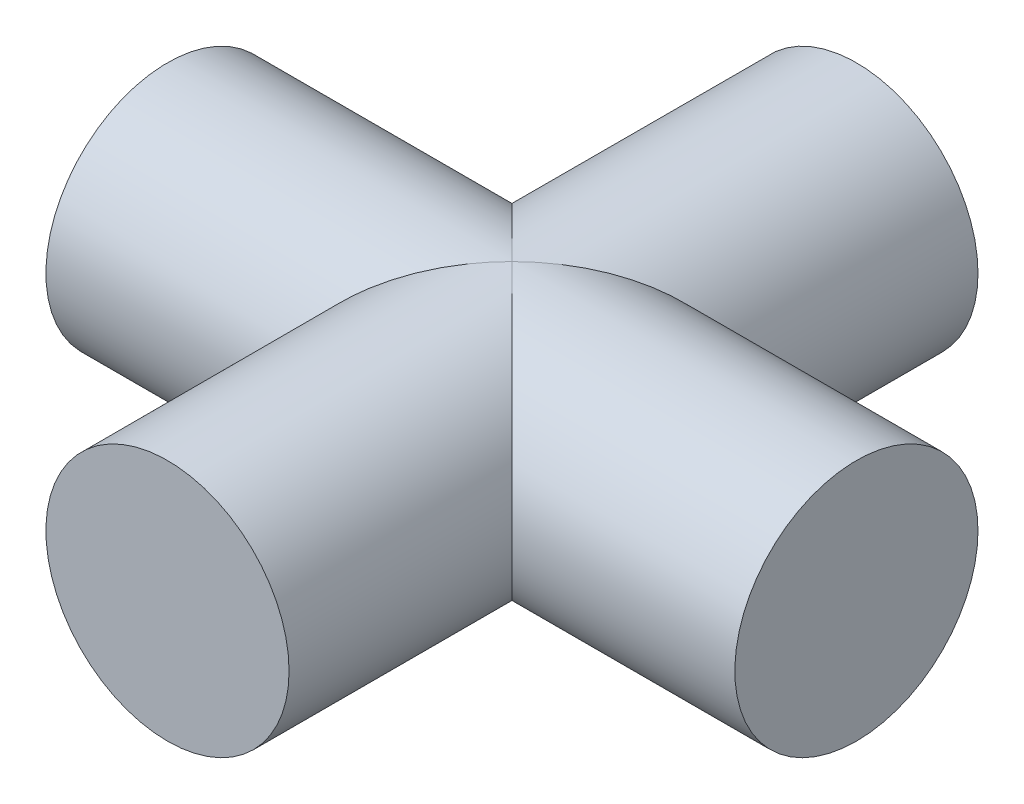
ISO-10303-21;
HEADER;
FILE_DESCRIPTION(('STEP AP214'),'2;1');
FILE_NAME('part.step','',(''),(''),'','','');
FILE_SCHEMA(('AUTOMOTIVE_DESIGN { 1 0 10303 214 1 1 1 1 }'));
ENDSEC;
DATA;
#1=APPLICATION_CONTEXT('core data for automotive mechanical design processes');
#2=APPLICATION_PROTOCOL_DEFINITION('international standard','automotive_design',2000,#1);
#3=PRODUCT_CONTEXT('',#1,'mechanical');
#4=PRODUCT('Part','Part','',(#3));
#5=PRODUCT_RELATED_PRODUCT_CATEGORY('part','',(#4));
#6=PRODUCT_DEFINITION_FORMATION('','',#4);
#7=PRODUCT_DEFINITION_CONTEXT('part definition',#1,'design');
#8=PRODUCT_DEFINITION('design','',#6,#7);
#9=PRODUCT_DEFINITION_SHAPE('','',#8);
#10=(LENGTH_UNIT() NAMED_UNIT(*) SI_UNIT(.MILLI.,.METRE.));
#11=(NAMED_UNIT(*) PLANE_ANGLE_UNIT() SI_UNIT($,.RADIAN.));
#12=(NAMED_UNIT(*) SI_UNIT($,.STERADIAN.) SOLID_ANGLE_UNIT());
#13=UNCERTAINTY_MEASURE_WITH_UNIT(LENGTH_MEASURE(1.E-05),#10,'distance_accuracy_value','');
#14=(GEOMETRIC_REPRESENTATION_CONTEXT(3) GLOBAL_UNCERTAINTY_ASSIGNED_CONTEXT((#13)) GLOBAL_UNIT_ASSIGNED_CONTEXT((#10,
#11,#12)) REPRESENTATION_CONTEXT('',''));
#15=CARTESIAN_POINT('',(0.,0.,0.));
#16=DIRECTION('',(0.,0.,1.));
#17=DIRECTION('',(1.,0.,0.));
#18=AXIS2_PLACEMENT_3D('',#15,#16,#17);
#19=CARTESIAN_POINT('',(0.,0.,13.5));
#20=DIRECTION('',(0.,0.,-1.));
#21=DIRECTION('',(-1.,0.,0.));
#22=AXIS2_PLACEMENT_3D('',#19,#20,#21);
#23=CYLINDRICAL_SURFACE('',#22,4.765);
#24=CARTESIAN_POINT('',(0.,0.,13.5));
#25=DIRECTION('',(0.,0.,1.));
#26=DIRECTION('',(1.,0.,0.));
#27=AXIS2_PLACEMENT_3D('',#24,#25,#26);
#28=CIRCLE('',#27,4.765);
#29=CARTESIAN_POINT('',(4.765,0.,13.5));
#30=VERTEX_POINT('',#29);
#31=EDGE_CURVE('E82',#30,#30,#28,.T.);
#32=ORIENTED_EDGE('',*,*,#31,.F.);
#33=EDGE_LOOP('',(#32));
#34=FACE_BOUND('',#33,.T.);
#35=CARTESIAN_POINT('',(0.,0.,0.));
#36=DIRECTION('',(-0.707106781186547,0.,-0.707106781186547));
#37=DIRECTION('',(0.707106781186547,0.,-0.707106781186547));
#38=AXIS2_PLACEMENT_3D('',#35,#36,#37);
#39=ELLIPSE('',#38,6.7387276247078,4.765);
#40=CARTESIAN_POINT('',(0.,-4.765,0.));
#41=VERTEX_POINT('',#40);
#42=CARTESIAN_POINT('',(0.,4.765,0.));
#43=VERTEX_POINT('',#42);
#44=EDGE_CURVE('E64',#41,#43,#39,.T.);
#45=ORIENTED_EDGE('',*,*,#44,.F.);
#46=CARTESIAN_POINT('',(0.,0.,0.));
#47=DIRECTION('',(0.707106781186547,0.,-0.707106781186547));
#48=DIRECTION('',(-0.707106781186547,0.,-0.707106781186547));
#49=AXIS2_PLACEMENT_3D('',#46,#47,#48);
#50=ELLIPSE('',#49,6.7387276247078,4.765);
#51=EDGE_CURVE('E76',#43,#41,#50,.T.);
#52=ORIENTED_EDGE('',*,*,#51,.F.);
#53=EDGE_LOOP('',(#45,#52));
#54=FACE_BOUND('',#53,.T.);
#55=ADVANCED_FACE('F55',(#34,#54),#23,.T.);
#56=CARTESIAN_POINT('',(0.,0.,13.5));
#57=DIRECTION('',(0.,0.,1.));
#58=DIRECTION('',(1.,0.,0.));
#59=AXIS2_PLACEMENT_3D('',#56,#57,#58);
#60=PLANE('',#59);
#61=ORIENTED_EDGE('',*,*,#31,.T.);
#62=EDGE_LOOP('',(#61));
#63=FACE_BOUND('',#62,.T.);
#64=ADVANCED_FACE('F106',(#63),#60,.T.);
#65=CARTESIAN_POINT('',(-13.5,0.,0.));
#66=DIRECTION('',(1.,0.,0.));
#67=DIRECTION('',(0.,0.,-1.));
#68=AXIS2_PLACEMENT_3D('',#65,#66,#67);
#69=PLANE('',#68);
#70=CARTESIAN_POINT('',(-13.5,0.,0.));
#71=DIRECTION('',(1.,0.,0.));
#72=DIRECTION('',(0.,0.,-1.));
#73=AXIS2_PLACEMENT_3D('',#70,#71,#72);
#74=CIRCLE('',#73,4.765);
#75=CARTESIAN_POINT('',(-13.5,0.,-4.765));
#76=VERTEX_POINT('',#75);
#77=EDGE_CURVE('E122',#76,#76,#74,.T.);
#78=ORIENTED_EDGE('',*,*,#77,.F.);
#79=EDGE_LOOP('',(#78));
#80=FACE_BOUND('',#79,.T.);
#81=ADVANCED_FACE('F103',(#80),#69,.F.);
#82=CARTESIAN_POINT('',(13.5,0.,0.));
#83=DIRECTION('',(-1.,0.,0.));
#84=DIRECTION('',(0.,0.,1.));
#85=AXIS2_PLACEMENT_3D('',#82,#83,#84);
#86=CYLINDRICAL_SURFACE('',#85,4.765);
#87=ORIENTED_EDGE('',*,*,#77,.T.);
#88=EDGE_LOOP('',(#87));
#89=FACE_BOUND('',#88,.T.);
#90=CARTESIAN_POINT('',(0.,0.,0.));
#91=DIRECTION('',(0.707106781186547,0.,-0.707106781186547));
#92=DIRECTION('',(-0.707106781186547,0.,-0.707106781186547));
#93=AXIS2_PLACEMENT_3D('',#90,#91,#92);
#94=ELLIPSE('',#93,6.7387276247078,4.765);
#95=EDGE_CURVE('E70',#43,#41,#94,.F.);
#96=ORIENTED_EDGE('',*,*,#95,.T.);
#97=ORIENTED_EDGE('',*,*,#44,.T.);
#98=EDGE_LOOP('',(#96,#97));
#99=FACE_BOUND('',#98,.T.);
#100=ADVANCED_FACE('F84',(#89,#99),#86,.T.);
#101=CARTESIAN_POINT('',(0.,0.,-13.5));
#102=DIRECTION('',(0.,0.,1.));
#103=DIRECTION('',(1.,0.,0.));
#104=AXIS2_PLACEMENT_3D('',#101,#102,#103);
#105=PLANE('',#104);
#106=CARTESIAN_POINT('',(0.,0.,-13.5));
#107=DIRECTION('',(0.,0.,1.));
#108=DIRECTION('',(1.,0.,0.));
#109=AXIS2_PLACEMENT_3D('',#106,#107,#108);
#110=CIRCLE('',#109,4.765);
#111=CARTESIAN_POINT('',(4.765,0.,-13.5));
#112=VERTEX_POINT('',#111);
#113=EDGE_CURVE('E115',#112,#112,#110,.T.);
#114=ORIENTED_EDGE('',*,*,#113,.F.);
#115=EDGE_LOOP('',(#114));
#116=FACE_BOUND('',#115,.T.);
#117=ADVANCED_FACE('F97',(#116),#105,.F.);
#118=ORIENTED_EDGE('',*,*,#113,.T.);
#119=EDGE_LOOP('',(#118));
#120=FACE_BOUND('',#119,.T.);
#121=CARTESIAN_POINT('',(0.,0.,0.));
#122=DIRECTION('',(-0.707106781186547,0.,-0.707106781186547));
#123=DIRECTION('',(0.707106781186547,0.,-0.707106781186547));
#124=AXIS2_PLACEMENT_3D('',#121,#122,#123);
#125=ELLIPSE('',#124,6.7387276247078,4.765);
#126=EDGE_CURVE('E13',#41,#43,#125,.F.);
#127=ORIENTED_EDGE('',*,*,#126,.F.);
#128=ORIENTED_EDGE('',*,*,#95,.F.);
#129=EDGE_LOOP('',(#127,#128));
#130=FACE_BOUND('',#129,.T.);
#131=ADVANCED_FACE('F57',(#120,#130),#23,.T.);
#132=CARTESIAN_POINT('',(13.5,0.,0.));
#133=DIRECTION('',(1.,0.,0.));
#134=DIRECTION('',(0.,0.,-1.));
#135=AXIS2_PLACEMENT_3D('',#132,#133,#134);
#136=CIRCLE('',#135,4.765);
#137=CARTESIAN_POINT('',(13.5,0.,-4.765));
#138=VERTEX_POINT('',#137);
#139=EDGE_CURVE('E119',#138,#138,#136,.T.);
#140=ORIENTED_EDGE('',*,*,#139,.F.);
#141=EDGE_LOOP('',(#140));
#142=FACE_BOUND('',#141,.T.);
#143=ORIENTED_EDGE('',*,*,#51,.T.);
#144=ORIENTED_EDGE('',*,*,#126,.T.);
#145=EDGE_LOOP('',(#143,#144));
#146=FACE_BOUND('',#145,.T.);
#147=ADVANCED_FACE('F86',(#142,#146),#86,.T.);
#148=CARTESIAN_POINT('',(13.5,0.,0.));
#149=DIRECTION('',(1.,0.,0.));
#150=DIRECTION('',(0.,0.,-1.));
#151=AXIS2_PLACEMENT_3D('',#148,#149,#150);
#152=PLANE('',#151);
#153=ORIENTED_EDGE('',*,*,#139,.T.);
#154=EDGE_LOOP('',(#153));
#155=FACE_BOUND('',#154,.T.);
#156=ADVANCED_FACE('F88',(#155),#152,.T.);
#157=CLOSED_SHELL('',(#55,#64,#81,#100,#117,#131,#147,#156));
#158=MANIFOLD_SOLID_BREP('B2',#157);
#159=ADVANCED_BREP_SHAPE_REPRESENTATION('',(#18,#158),#14);
#160=SHAPE_DEFINITION_REPRESENTATION(#9,#159);
ENDSEC;
END-ISO-10303-21;
